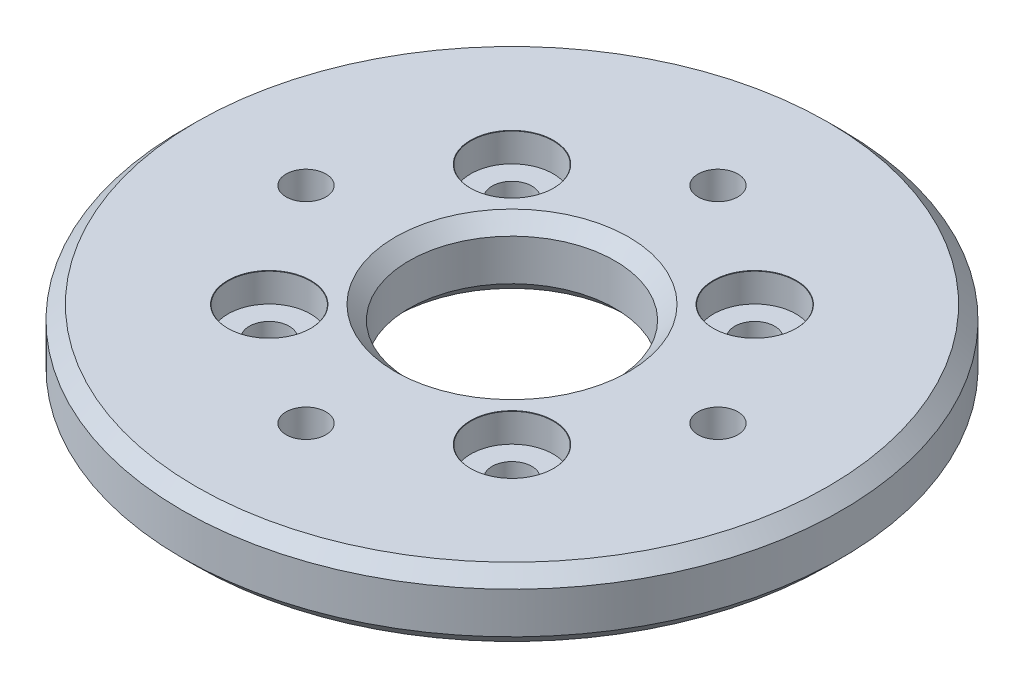
ISO-10303-21;
HEADER;
FILE_DESCRIPTION(('STEP AP214'),'2;1');
FILE_NAME('part.step','',(''),(''),'','','');
FILE_SCHEMA(('AUTOMOTIVE_DESIGN { 1 0 10303 214 1 1 1 1 }'));
ENDSEC;
DATA;
#1=APPLICATION_CONTEXT('core data for automotive mechanical design processes');
#2=APPLICATION_PROTOCOL_DEFINITION('international standard','automotive_design',2000,#1);
#3=PRODUCT_CONTEXT('',#1,'mechanical');
#4=PRODUCT('Part','Part','',(#3));
#5=PRODUCT_RELATED_PRODUCT_CATEGORY('part','',(#4));
#6=PRODUCT_DEFINITION_FORMATION('','',#4);
#7=PRODUCT_DEFINITION_CONTEXT('part definition',#1,'design');
#8=PRODUCT_DEFINITION('design','',#6,#7);
#9=PRODUCT_DEFINITION_SHAPE('','',#8);
#10=(LENGTH_UNIT() NAMED_UNIT(*) SI_UNIT(.MILLI.,.METRE.));
#11=(NAMED_UNIT(*) PLANE_ANGLE_UNIT() SI_UNIT($,.RADIAN.));
#12=(NAMED_UNIT(*) SI_UNIT($,.STERADIAN.) SOLID_ANGLE_UNIT());
#13=UNCERTAINTY_MEASURE_WITH_UNIT(LENGTH_MEASURE(1.E-05),#10,'distance_accuracy_value','');
#14=(GEOMETRIC_REPRESENTATION_CONTEXT(3) GLOBAL_UNCERTAINTY_ASSIGNED_CONTEXT((#13)) GLOBAL_UNIT_ASSIGNED_CONTEXT((#10,
#11,#12)) REPRESENTATION_CONTEXT('',''));
#15=CARTESIAN_POINT('',(0.,0.,0.));
#16=DIRECTION('',(0.,0.,1.));
#17=DIRECTION('',(1.,0.,0.));
#18=AXIS2_PLACEMENT_3D('',#15,#16,#17);
#19=CARTESIAN_POINT('',(0.,5.,0.));
#20=DIRECTION('',(0.,1.,0.));
#21=DIRECTION('',(0.,0.,1.));
#22=AXIS2_PLACEMENT_3D('',#19,#20,#21);
#23=PLANE('',#22);
#24=CARTESIAN_POINT('',(0.,5.,0.));
#25=DIRECTION('',(0.,1.,0.));
#26=DIRECTION('',(0.,0.,1.));
#27=AXIS2_PLACEMENT_3D('',#24,#25,#26);
#28=CIRCLE('',#27,23.);
#29=CARTESIAN_POINT('',(0.,5.,23.));
#30=VERTEX_POINT('',#29);
#31=EDGE_CURVE('E10',#30,#30,#28,.T.);
#32=ORIENTED_EDGE('',*,*,#31,.T.);
#33=EDGE_LOOP('',(#32));
#34=FACE_BOUND('',#33,.T.);
#35=CARTESIAN_POINT('',(0.,5.,0.));
#36=DIRECTION('',(0.,1.,0.));
#37=DIRECTION('',(0.,0.,1.));
#38=AXIS2_PLACEMENT_3D('',#35,#36,#37);
#39=CIRCLE('',#38,8.49999999999999);
#40=CARTESIAN_POINT('',(0.,5.,8.49999999999999));
#41=VERTEX_POINT('',#40);
#42=EDGE_CURVE('E70',#41,#41,#39,.F.);
#43=ORIENTED_EDGE('',*,*,#42,.T.);
#44=EDGE_LOOP('',(#43));
#45=FACE_BOUND('',#44,.T.);
#46=CARTESIAN_POINT('',(8.83883476483184,5.,8.83883476483184));
#47=DIRECTION('',(0.,1.,0.));
#48=DIRECTION('',(0.,0.,1.));
#49=AXIS2_PLACEMENT_3D('',#46,#47,#48);
#50=CIRCLE('',#49,3.025);
#51=CARTESIAN_POINT('',(8.83883476483184,5.,11.8638347648318));
#52=VERTEX_POINT('',#51);
#53=EDGE_CURVE('E102',#52,#52,#50,.T.);
#54=ORIENTED_EDGE('',*,*,#53,.F.);
#55=EDGE_LOOP('',(#54));
#56=FACE_BOUND('',#55,.T.);
#57=CARTESIAN_POINT('',(-8.83883476483184,5.,-8.83883476483184));
#58=DIRECTION('',(0.,1.,0.));
#59=DIRECTION('',(0.,0.,1.));
#60=AXIS2_PLACEMENT_3D('',#57,#58,#59);
#61=CIRCLE('',#60,3.025);
#62=CARTESIAN_POINT('',(-8.83883476483184,5.,-5.81383476483184));
#63=VERTEX_POINT('',#62);
#64=EDGE_CURVE('E122',#63,#63,#61,.T.);
#65=ORIENTED_EDGE('',*,*,#64,.F.);
#66=EDGE_LOOP('',(#65));
#67=FACE_BOUND('',#66,.T.);
#68=CARTESIAN_POINT('',(-8.83883476483184,5.,8.83883476483184));
#69=DIRECTION('',(0.,1.,0.));
#70=DIRECTION('',(0.,0.,1.));
#71=AXIS2_PLACEMENT_3D('',#68,#69,#70);
#72=CIRCLE('',#71,3.025);
#73=CARTESIAN_POINT('',(-8.83883476483184,5.,11.8638347648318));
#74=VERTEX_POINT('',#73);
#75=EDGE_CURVE('E142',#74,#74,#72,.T.);
#76=ORIENTED_EDGE('',*,*,#75,.F.);
#77=EDGE_LOOP('',(#76));
#78=FACE_BOUND('',#77,.T.);
#79=CARTESIAN_POINT('',(8.83883476483184,5.,-8.83883476483184));
#80=DIRECTION('',(0.,1.,0.));
#81=DIRECTION('',(0.,0.,1.));
#82=AXIS2_PLACEMENT_3D('',#79,#80,#81);
#83=CIRCLE('',#82,3.025);
#84=CARTESIAN_POINT('',(8.83883476483184,5.,-5.81383476483184));
#85=VERTEX_POINT('',#84);
#86=EDGE_CURVE('E162',#85,#85,#83,.T.);
#87=ORIENTED_EDGE('',*,*,#86,.F.);
#88=EDGE_LOOP('',(#87));
#89=FACE_BOUND('',#88,.T.);
#90=CARTESIAN_POINT('',(0.,5.,-15.));
#91=DIRECTION('',(0.,-1.,0.));
#92=DIRECTION('',(0.,0.,-1.));
#93=AXIS2_PLACEMENT_3D('',#90,#91,#92);
#94=CIRCLE('',#93,1.45);
#95=CARTESIAN_POINT('',(0.,5.,-16.45));
#96=VERTEX_POINT('',#95);
#97=EDGE_CURVE('E166',#96,#96,#94,.T.);
#98=ORIENTED_EDGE('',*,*,#97,.T.);
#99=EDGE_LOOP('',(#98));
#100=FACE_BOUND('',#99,.T.);
#101=CARTESIAN_POINT('',(0.,5.,15.));
#102=DIRECTION('',(0.,-1.,0.));
#103=DIRECTION('',(0.,0.,-1.));
#104=AXIS2_PLACEMENT_3D('',#101,#102,#103);
#105=CIRCLE('',#104,1.45);
#106=CARTESIAN_POINT('',(0.,5.,13.55));
#107=VERTEX_POINT('',#106);
#108=EDGE_CURVE('E186',#107,#107,#105,.T.);
#109=ORIENTED_EDGE('',*,*,#108,.T.);
#110=EDGE_LOOP('',(#109));
#111=FACE_BOUND('',#110,.T.);
#112=CARTESIAN_POINT('',(-15.,5.,0.));
#113=DIRECTION('',(0.,-1.,0.));
#114=DIRECTION('',(0.,0.,-1.));
#115=AXIS2_PLACEMENT_3D('',#112,#113,#114);
#116=CIRCLE('',#115,1.45);
#117=CARTESIAN_POINT('',(-15.,5.,-1.45));
#118=VERTEX_POINT('',#117);
#119=EDGE_CURVE('E206',#118,#118,#116,.T.);
#120=ORIENTED_EDGE('',*,*,#119,.T.);
#121=EDGE_LOOP('',(#120));
#122=FACE_BOUND('',#121,.T.);
#123=CARTESIAN_POINT('',(15.,5.,0.));
#124=DIRECTION('',(0.,-1.,0.));
#125=DIRECTION('',(0.,0.,-1.));
#126=AXIS2_PLACEMENT_3D('',#123,#124,#125);
#127=CIRCLE('',#126,1.45);
#128=CARTESIAN_POINT('',(15.,5.,-1.45));
#129=VERTEX_POINT('',#128);
#130=EDGE_CURVE('E226',#129,#129,#127,.T.);
#131=ORIENTED_EDGE('',*,*,#130,.T.);
#132=EDGE_LOOP('',(#131));
#133=FACE_BOUND('',#132,.T.);
#134=ADVANCED_FACE('F45',(#34,#45,#56,#67,#78,#89,#100,#111,#122,#133),#23,.T.);
#135=CARTESIAN_POINT('',(0.,5.,0.));
#136=DIRECTION('',(0.,-1.,0.));
#137=DIRECTION('',(0.,0.,-1.));
#138=AXIS2_PLACEMENT_3D('',#135,#136,#137);
#139=CYLINDRICAL_SURFACE('',#138,24.);
#140=CARTESIAN_POINT('',(0.,0.999999999999997,0.));
#141=DIRECTION('',(0.,1.,0.));
#142=DIRECTION('',(0.,0.,1.));
#143=AXIS2_PLACEMENT_3D('',#140,#141,#142);
#144=CIRCLE('',#143,24.);
#145=CARTESIAN_POINT('',(0.,0.999999999999997,24.));
#146=VERTEX_POINT('',#145);
#147=EDGE_CURVE('E59',#146,#146,#144,.T.);
#148=ORIENTED_EDGE('',*,*,#147,.T.);
#149=EDGE_LOOP('',(#148));
#150=FACE_BOUND('',#149,.T.);
#151=CARTESIAN_POINT('',(0.,4.00000000000001,0.));
#152=DIRECTION('',(0.,1.,0.));
#153=DIRECTION('',(0.,0.,1.));
#154=AXIS2_PLACEMENT_3D('',#151,#152,#153);
#155=CIRCLE('',#154,24.);
#156=CARTESIAN_POINT('',(0.,4.00000000000001,24.));
#157=VERTEX_POINT('',#156);
#158=EDGE_CURVE('E64',#157,#157,#155,.F.);
#159=ORIENTED_EDGE('',*,*,#158,.T.);
#160=EDGE_LOOP('',(#159));
#161=FACE_BOUND('',#160,.T.);
#162=ADVANCED_FACE('F253',(#150,#161),#139,.T.);
#163=CARTESIAN_POINT('',(0.,0.,0.));
#164=DIRECTION('',(0.,1.,0.));
#165=DIRECTION('',(0.,0.,1.));
#166=AXIS2_PLACEMENT_3D('',#163,#164,#165);
#167=PLANE('',#166);
#168=CARTESIAN_POINT('',(0.,0.,0.));
#169=DIRECTION('',(0.,1.,0.));
#170=DIRECTION('',(0.,0.,1.));
#171=AXIS2_PLACEMENT_3D('',#168,#169,#170);
#172=CIRCLE('',#171,23.);
#173=CARTESIAN_POINT('',(0.,0.,23.));
#174=VERTEX_POINT('',#173);
#175=EDGE_CURVE('E54',#174,#174,#172,.F.);
#176=ORIENTED_EDGE('',*,*,#175,.T.);
#177=EDGE_LOOP('',(#176));
#178=FACE_BOUND('',#177,.T.);
#179=CARTESIAN_POINT('',(0.,0.,0.));
#180=DIRECTION('',(0.,1.,0.));
#181=DIRECTION('',(0.,0.,1.));
#182=AXIS2_PLACEMENT_3D('',#179,#180,#181);
#183=CIRCLE('',#182,8.49999999999999);
#184=CARTESIAN_POINT('',(0.,0.,8.49999999999999));
#185=VERTEX_POINT('',#184);
#186=EDGE_CURVE('E82',#185,#185,#183,.T.);
#187=ORIENTED_EDGE('',*,*,#186,.T.);
#188=EDGE_LOOP('',(#187));
#189=FACE_BOUND('',#188,.T.);
#190=CARTESIAN_POINT('',(15.,0.,0.));
#191=DIRECTION('',(0.,-1.,0.));
#192=DIRECTION('',(0.,0.,-1.));
#193=AXIS2_PLACEMENT_3D('',#190,#191,#192);
#194=CIRCLE('',#193,3.025);
#195=CARTESIAN_POINT('',(15.,0.,-3.025));
#196=VERTEX_POINT('',#195);
#197=EDGE_CURVE('E242',#196,#196,#194,.T.);
#198=ORIENTED_EDGE('',*,*,#197,.F.);
#199=EDGE_LOOP('',(#198));
#200=FACE_BOUND('',#199,.T.);
#201=CARTESIAN_POINT('',(-15.,0.,0.));
#202=DIRECTION('',(0.,-1.,0.));
#203=DIRECTION('',(0.,0.,-1.));
#204=AXIS2_PLACEMENT_3D('',#201,#202,#203);
#205=CIRCLE('',#204,3.025);
#206=CARTESIAN_POINT('',(-15.,0.,-3.025));
#207=VERTEX_POINT('',#206);
#208=EDGE_CURVE('E222',#207,#207,#205,.T.);
#209=ORIENTED_EDGE('',*,*,#208,.F.);
#210=EDGE_LOOP('',(#209));
#211=FACE_BOUND('',#210,.T.);
#212=CARTESIAN_POINT('',(0.,0.,15.));
#213=DIRECTION('',(0.,-1.,0.));
#214=DIRECTION('',(0.,0.,-1.));
#215=AXIS2_PLACEMENT_3D('',#212,#213,#214);
#216=CIRCLE('',#215,3.025);
#217=CARTESIAN_POINT('',(0.,0.,11.975));
#218=VERTEX_POINT('',#217);
#219=EDGE_CURVE('E202',#218,#218,#216,.T.);
#220=ORIENTED_EDGE('',*,*,#219,.F.);
#221=EDGE_LOOP('',(#220));
#222=FACE_BOUND('',#221,.T.);
#223=CARTESIAN_POINT('',(0.,0.,-15.));
#224=DIRECTION('',(0.,-1.,0.));
#225=DIRECTION('',(0.,0.,-1.));
#226=AXIS2_PLACEMENT_3D('',#223,#224,#225);
#227=CIRCLE('',#226,3.025);
#228=CARTESIAN_POINT('',(0.,0.,-18.025));
#229=VERTEX_POINT('',#228);
#230=EDGE_CURVE('E182',#229,#229,#227,.T.);
#231=ORIENTED_EDGE('',*,*,#230,.F.);
#232=EDGE_LOOP('',(#231));
#233=FACE_BOUND('',#232,.T.);
#234=CARTESIAN_POINT('',(8.83883476483184,0.,-8.83883476483184));
#235=DIRECTION('',(0.,1.,0.));
#236=DIRECTION('',(0.,0.,1.));
#237=AXIS2_PLACEMENT_3D('',#234,#235,#236);
#238=CIRCLE('',#237,1.45);
#239=CARTESIAN_POINT('',(8.83883476483184,0.,-7.38883476483185));
#240=VERTEX_POINT('',#239);
#241=EDGE_CURVE('E146',#240,#240,#238,.T.);
#242=ORIENTED_EDGE('',*,*,#241,.T.);
#243=EDGE_LOOP('',(#242));
#244=FACE_BOUND('',#243,.T.);
#245=CARTESIAN_POINT('',(-8.83883476483184,0.,8.83883476483184));
#246=DIRECTION('',(0.,1.,0.));
#247=DIRECTION('',(0.,0.,1.));
#248=AXIS2_PLACEMENT_3D('',#245,#246,#247);
#249=CIRCLE('',#248,1.45);
#250=CARTESIAN_POINT('',(-8.83883476483184,0.,10.2888347648318));
#251=VERTEX_POINT('',#250);
#252=EDGE_CURVE('E126',#251,#251,#249,.T.);
#253=ORIENTED_EDGE('',*,*,#252,.T.);
#254=EDGE_LOOP('',(#253));
#255=FACE_BOUND('',#254,.T.);
#256=CARTESIAN_POINT('',(-8.83883476483184,0.,-8.83883476483184));
#257=DIRECTION('',(0.,1.,0.));
#258=DIRECTION('',(0.,0.,1.));
#259=AXIS2_PLACEMENT_3D('',#256,#257,#258);
#260=CIRCLE('',#259,1.45);
#261=CARTESIAN_POINT('',(-8.83883476483184,0.,-7.38883476483185));
#262=VERTEX_POINT('',#261);
#263=EDGE_CURVE('E106',#262,#262,#260,.T.);
#264=ORIENTED_EDGE('',*,*,#263,.T.);
#265=EDGE_LOOP('',(#264));
#266=FACE_BOUND('',#265,.T.);
#267=CARTESIAN_POINT('',(8.83883476483184,0.,8.83883476483184));
#268=DIRECTION('',(0.,1.,0.));
#269=DIRECTION('',(0.,0.,1.));
#270=AXIS2_PLACEMENT_3D('',#267,#268,#269);
#271=CIRCLE('',#270,1.45);
#272=CARTESIAN_POINT('',(8.83883476483184,0.,10.2888347648318));
#273=VERTEX_POINT('',#272);
#274=EDGE_CURVE('E86',#273,#273,#271,.T.);
#275=ORIENTED_EDGE('',*,*,#274,.T.);
#276=EDGE_LOOP('',(#275));
#277=FACE_BOUND('',#276,.T.);
#278=ADVANCED_FACE('F249',(#178,#189,#200,#211,#222,#233,#244,#255,#266,#277),#167,.F.);
#279=CARTESIAN_POINT('',(8.83883476483184,5.,8.83883476483184));
#280=DIRECTION('',(0.,1.,0.));
#281=DIRECTION('',(0.,0.,1.));
#282=AXIS2_PLACEMENT_3D('',#279,#280,#281);
#283=CYLINDRICAL_SURFACE('',#282,1.45);
#284=ORIENTED_EDGE('',*,*,#274,.F.);
#285=EDGE_LOOP('',(#284));
#286=FACE_BOUND('',#285,.T.);
#287=CARTESIAN_POINT('',(8.83883476483184,2.9,8.83883476483184));
#288=DIRECTION('',(0.,1.,0.));
#289=DIRECTION('',(0.,0.,1.));
#290=AXIS2_PLACEMENT_3D('',#287,#288,#289);
#291=CIRCLE('',#290,1.45);
#292=CARTESIAN_POINT('',(8.83883476483184,2.9,10.2888347648318));
#293=VERTEX_POINT('',#292);
#294=EDGE_CURVE('E90',#293,#293,#291,.T.);
#295=ORIENTED_EDGE('',*,*,#294,.T.);
#296=EDGE_LOOP('',(#295));
#297=FACE_BOUND('',#296,.T.);
#298=ADVANCED_FACE('F252',(#286,#297),#283,.F.);
#299=CARTESIAN_POINT('',(11.8388347648318,2.9,8.83883476483184));
#300=DIRECTION('',(0.,-1.,0.));
#301=DIRECTION('',(0.,0.,-1.));
#302=AXIS2_PLACEMENT_3D('',#299,#300,#301);
#303=PLANE('',#302);
#304=ORIENTED_EDGE('',*,*,#294,.F.);
#305=EDGE_LOOP('',(#304));
#306=FACE_BOUND('',#305,.T.);
#307=CARTESIAN_POINT('',(8.83883476483184,2.9,8.83883476483184));
#308=DIRECTION('',(0.,1.,0.));
#309=DIRECTION('',(0.,0.,1.));
#310=AXIS2_PLACEMENT_3D('',#307,#308,#309);
#311=CIRCLE('',#310,3.);
#312=CARTESIAN_POINT('',(8.83883476483184,2.9,11.8388347648318));
#313=VERTEX_POINT('',#312);
#314=EDGE_CURVE('E94',#313,#313,#311,.T.);
#315=ORIENTED_EDGE('',*,*,#314,.T.);
#316=EDGE_LOOP('',(#315));
#317=FACE_BOUND('',#316,.T.);
#318=ADVANCED_FACE('F271',(#306,#317),#303,.F.);
#319=CARTESIAN_POINT('',(8.83883476483184,5.,8.83883476483184));
#320=DIRECTION('',(0.,1.,0.));
#321=DIRECTION('',(0.,0.,1.));
#322=AXIS2_PLACEMENT_3D('',#319,#320,#321);
#323=CYLINDRICAL_SURFACE('',#322,3.);
#324=ORIENTED_EDGE('',*,*,#314,.F.);
#325=EDGE_LOOP('',(#324));
#326=FACE_BOUND('',#325,.T.);
#327=CARTESIAN_POINT('',(8.83883476483184,4.975,8.83883476483184));
#328=DIRECTION('',(0.,1.,0.));
#329=DIRECTION('',(0.,0.,1.));
#330=AXIS2_PLACEMENT_3D('',#327,#328,#329);
#331=CIRCLE('',#330,3.);
#332=CARTESIAN_POINT('',(8.83883476483184,4.975,11.8388347648318));
#333=VERTEX_POINT('',#332);
#334=EDGE_CURVE('E98',#333,#333,#331,.T.);
#335=ORIENTED_EDGE('',*,*,#334,.T.);
#336=EDGE_LOOP('',(#335));
#337=FACE_BOUND('',#336,.T.);
#338=ADVANCED_FACE('F277',(#326,#337),#323,.F.);
#339=CARTESIAN_POINT('',(8.83883476483184,5.,8.83883476483184));
#340=DIRECTION('',(0.,1.,0.));
#341=DIRECTION('',(0.,0.,1.));
#342=AXIS2_PLACEMENT_3D('',#339,#340,#341);
#343=CONICAL_SURFACE('',#342,3.025,0.785398163397466);
#344=ORIENTED_EDGE('',*,*,#334,.F.);
#345=EDGE_LOOP('',(#344));
#346=FACE_BOUND('',#345,.T.);
#347=ORIENTED_EDGE('',*,*,#53,.T.);
#348=EDGE_LOOP('',(#347));
#349=FACE_BOUND('',#348,.T.);
#350=ADVANCED_FACE('F283',(#346,#349),#343,.F.);
#351=CARTESIAN_POINT('',(-8.83883476483184,5.,-8.83883476483184));
#352=DIRECTION('',(0.,1.,0.));
#353=DIRECTION('',(0.,0.,1.));
#354=AXIS2_PLACEMENT_3D('',#351,#352,#353);
#355=CYLINDRICAL_SURFACE('',#354,1.45);
#356=ORIENTED_EDGE('',*,*,#263,.F.);
#357=EDGE_LOOP('',(#356));
#358=FACE_BOUND('',#357,.T.);
#359=CARTESIAN_POINT('',(-8.83883476483184,2.9,-8.83883476483184));
#360=DIRECTION('',(0.,1.,0.));
#361=DIRECTION('',(0.,0.,1.));
#362=AXIS2_PLACEMENT_3D('',#359,#360,#361);
#363=CIRCLE('',#362,1.45);
#364=CARTESIAN_POINT('',(-8.83883476483184,2.9,-7.38883476483184));
#365=VERTEX_POINT('',#364);
#366=EDGE_CURVE('E110',#365,#365,#363,.T.);
#367=ORIENTED_EDGE('',*,*,#366,.T.);
#368=EDGE_LOOP('',(#367));
#369=FACE_BOUND('',#368,.T.);
#370=ADVANCED_FACE('F289',(#358,#369),#355,.F.);
#371=CARTESIAN_POINT('',(-5.83883476483184,2.9,-8.83883476483184));
#372=DIRECTION('',(0.,-1.,0.));
#373=DIRECTION('',(0.,0.,-1.));
#374=AXIS2_PLACEMENT_3D('',#371,#372,#373);
#375=PLANE('',#374);
#376=ORIENTED_EDGE('',*,*,#366,.F.);
#377=EDGE_LOOP('',(#376));
#378=FACE_BOUND('',#377,.T.);
#379=CARTESIAN_POINT('',(-8.83883476483184,2.9,-8.83883476483184));
#380=DIRECTION('',(0.,1.,0.));
#381=DIRECTION('',(0.,0.,1.));
#382=AXIS2_PLACEMENT_3D('',#379,#380,#381);
#383=CIRCLE('',#382,3.);
#384=CARTESIAN_POINT('',(-8.83883476483184,2.9,-5.83883476483184));
#385=VERTEX_POINT('',#384);
#386=EDGE_CURVE('E114',#385,#385,#383,.T.);
#387=ORIENTED_EDGE('',*,*,#386,.T.);
#388=EDGE_LOOP('',(#387));
#389=FACE_BOUND('',#388,.T.);
#390=ADVANCED_FACE('F425',(#378,#389),#375,.F.);
#391=CARTESIAN_POINT('',(-8.83883476483184,5.,-8.83883476483184));
#392=DIRECTION('',(0.,1.,0.));
#393=DIRECTION('',(0.,0.,1.));
#394=AXIS2_PLACEMENT_3D('',#391,#392,#393);
#395=CYLINDRICAL_SURFACE('',#394,3.);
#396=ORIENTED_EDGE('',*,*,#386,.F.);
#397=EDGE_LOOP('',(#396));
#398=FACE_BOUND('',#397,.T.);
#399=CARTESIAN_POINT('',(-8.83883476483184,4.975,-8.83883476483184));
#400=DIRECTION('',(0.,1.,0.));
#401=DIRECTION('',(0.,0.,1.));
#402=AXIS2_PLACEMENT_3D('',#399,#400,#401);
#403=CIRCLE('',#402,3.);
#404=CARTESIAN_POINT('',(-8.83883476483184,4.975,-5.83883476483184));
#405=VERTEX_POINT('',#404);
#406=EDGE_CURVE('E118',#405,#405,#403,.T.);
#407=ORIENTED_EDGE('',*,*,#406,.T.);
#408=EDGE_LOOP('',(#407));
#409=FACE_BOUND('',#408,.T.);
#410=ADVANCED_FACE('F421',(#398,#409),#395,.F.);
#411=CARTESIAN_POINT('',(-8.83883476483184,5.,-8.83883476483184));
#412=DIRECTION('',(0.,1.,0.));
#413=DIRECTION('',(0.,0.,1.));
#414=AXIS2_PLACEMENT_3D('',#411,#412,#413);
#415=CONICAL_SURFACE('',#414,3.025,0.785398163397466);
#416=ORIENTED_EDGE('',*,*,#406,.F.);
#417=EDGE_LOOP('',(#416));
#418=FACE_BOUND('',#417,.T.);
#419=ORIENTED_EDGE('',*,*,#64,.T.);
#420=EDGE_LOOP('',(#419));
#421=FACE_BOUND('',#420,.T.);
#422=ADVANCED_FACE('F417',(#418,#421),#415,.F.);
#423=CARTESIAN_POINT('',(-8.83883476483184,5.,8.83883476483184));
#424=DIRECTION('',(0.,1.,0.));
#425=DIRECTION('',(0.,0.,1.));
#426=AXIS2_PLACEMENT_3D('',#423,#424,#425);
#427=CYLINDRICAL_SURFACE('',#426,1.45);
#428=ORIENTED_EDGE('',*,*,#252,.F.);
#429=EDGE_LOOP('',(#428));
#430=FACE_BOUND('',#429,.T.);
#431=CARTESIAN_POINT('',(-8.83883476483184,2.9,8.83883476483184));
#432=DIRECTION('',(0.,1.,0.));
#433=DIRECTION('',(0.,0.,1.));
#434=AXIS2_PLACEMENT_3D('',#431,#432,#433);
#435=CIRCLE('',#434,1.45);
#436=CARTESIAN_POINT('',(-8.83883476483184,2.9,10.2888347648318));
#437=VERTEX_POINT('',#436);
#438=EDGE_CURVE('E130',#437,#437,#435,.T.);
#439=ORIENTED_EDGE('',*,*,#438,.T.);
#440=EDGE_LOOP('',(#439));
#441=FACE_BOUND('',#440,.T.);
#442=ADVANCED_FACE('F413',(#430,#441),#427,.F.);
#443=CARTESIAN_POINT('',(-5.83883476483184,2.9,8.83883476483184));
#444=DIRECTION('',(0.,-1.,0.));
#445=DIRECTION('',(0.,0.,-1.));
#446=AXIS2_PLACEMENT_3D('',#443,#444,#445);
#447=PLANE('',#446);
#448=ORIENTED_EDGE('',*,*,#438,.F.);
#449=EDGE_LOOP('',(#448));
#450=FACE_BOUND('',#449,.T.);
#451=CARTESIAN_POINT('',(-8.83883476483184,2.9,8.83883476483184));
#452=DIRECTION('',(0.,1.,0.));
#453=DIRECTION('',(0.,0.,1.));
#454=AXIS2_PLACEMENT_3D('',#451,#452,#453);
#455=CIRCLE('',#454,3.);
#456=CARTESIAN_POINT('',(-8.83883476483184,2.9,11.8388347648318));
#457=VERTEX_POINT('',#456);
#458=EDGE_CURVE('E134',#457,#457,#455,.T.);
#459=ORIENTED_EDGE('',*,*,#458,.T.);
#460=EDGE_LOOP('',(#459));
#461=FACE_BOUND('',#460,.T.);
#462=ADVANCED_FACE('F409',(#450,#461),#447,.F.);
#463=CARTESIAN_POINT('',(-8.83883476483184,5.,8.83883476483184));
#464=DIRECTION('',(0.,1.,0.));
#465=DIRECTION('',(0.,0.,1.));
#466=AXIS2_PLACEMENT_3D('',#463,#464,#465);
#467=CYLINDRICAL_SURFACE('',#466,3.);
#468=ORIENTED_EDGE('',*,*,#458,.F.);
#469=EDGE_LOOP('',(#468));
#470=FACE_BOUND('',#469,.T.);
#471=CARTESIAN_POINT('',(-8.83883476483184,4.975,8.83883476483184));
#472=DIRECTION('',(0.,1.,0.));
#473=DIRECTION('',(0.,0.,1.));
#474=AXIS2_PLACEMENT_3D('',#471,#472,#473);
#475=CIRCLE('',#474,3.);
#476=CARTESIAN_POINT('',(-8.83883476483184,4.975,11.8388347648318));
#477=VERTEX_POINT('',#476);
#478=EDGE_CURVE('E138',#477,#477,#475,.T.);
#479=ORIENTED_EDGE('',*,*,#478,.T.);
#480=EDGE_LOOP('',(#479));
#481=FACE_BOUND('',#480,.T.);
#482=ADVANCED_FACE('F405',(#470,#481),#467,.F.);
#483=CARTESIAN_POINT('',(-8.83883476483184,5.,8.83883476483184));
#484=DIRECTION('',(0.,1.,0.));
#485=DIRECTION('',(0.,0.,1.));
#486=AXIS2_PLACEMENT_3D('',#483,#484,#485);
#487=CONICAL_SURFACE('',#486,3.025,0.785398163397466);
#488=ORIENTED_EDGE('',*,*,#478,.F.);
#489=EDGE_LOOP('',(#488));
#490=FACE_BOUND('',#489,.T.);
#491=ORIENTED_EDGE('',*,*,#75,.T.);
#492=EDGE_LOOP('',(#491));
#493=FACE_BOUND('',#492,.T.);
#494=ADVANCED_FACE('F401',(#490,#493),#487,.F.);
#495=CARTESIAN_POINT('',(8.83883476483184,5.,-8.83883476483184));
#496=DIRECTION('',(0.,1.,0.));
#497=DIRECTION('',(0.,0.,1.));
#498=AXIS2_PLACEMENT_3D('',#495,#496,#497);
#499=CYLINDRICAL_SURFACE('',#498,1.45);
#500=ORIENTED_EDGE('',*,*,#241,.F.);
#501=EDGE_LOOP('',(#500));
#502=FACE_BOUND('',#501,.T.);
#503=CARTESIAN_POINT('',(8.83883476483184,2.9,-8.83883476483184));
#504=DIRECTION('',(0.,1.,0.));
#505=DIRECTION('',(0.,0.,1.));
#506=AXIS2_PLACEMENT_3D('',#503,#504,#505);
#507=CIRCLE('',#506,1.45);
#508=CARTESIAN_POINT('',(8.83883476483184,2.9,-7.38883476483184));
#509=VERTEX_POINT('',#508);
#510=EDGE_CURVE('E150',#509,#509,#507,.T.);
#511=ORIENTED_EDGE('',*,*,#510,.T.);
#512=EDGE_LOOP('',(#511));
#513=FACE_BOUND('',#512,.T.);
#514=ADVANCED_FACE('F397',(#502,#513),#499,.F.);
#515=CARTESIAN_POINT('',(11.8388347648318,2.9,-8.83883476483184));
#516=DIRECTION('',(0.,-1.,0.));
#517=DIRECTION('',(0.,0.,-1.));
#518=AXIS2_PLACEMENT_3D('',#515,#516,#517);
#519=PLANE('',#518);
#520=ORIENTED_EDGE('',*,*,#510,.F.);
#521=EDGE_LOOP('',(#520));
#522=FACE_BOUND('',#521,.T.);
#523=CARTESIAN_POINT('',(8.83883476483184,2.9,-8.83883476483184));
#524=DIRECTION('',(0.,1.,0.));
#525=DIRECTION('',(0.,0.,1.));
#526=AXIS2_PLACEMENT_3D('',#523,#524,#525);
#527=CIRCLE('',#526,3.);
#528=CARTESIAN_POINT('',(8.83883476483184,2.9,-5.83883476483184));
#529=VERTEX_POINT('',#528);
#530=EDGE_CURVE('E154',#529,#529,#527,.T.);
#531=ORIENTED_EDGE('',*,*,#530,.T.);
#532=EDGE_LOOP('',(#531));
#533=FACE_BOUND('',#532,.T.);
#534=ADVANCED_FACE('F393',(#522,#533),#519,.F.);
#535=CARTESIAN_POINT('',(8.83883476483184,5.,-8.83883476483184));
#536=DIRECTION('',(0.,1.,0.));
#537=DIRECTION('',(0.,0.,1.));
#538=AXIS2_PLACEMENT_3D('',#535,#536,#537);
#539=CYLINDRICAL_SURFACE('',#538,3.);
#540=ORIENTED_EDGE('',*,*,#530,.F.);
#541=EDGE_LOOP('',(#540));
#542=FACE_BOUND('',#541,.T.);
#543=CARTESIAN_POINT('',(8.83883476483184,4.975,-8.83883476483184));
#544=DIRECTION('',(0.,1.,0.));
#545=DIRECTION('',(0.,0.,1.));
#546=AXIS2_PLACEMENT_3D('',#543,#544,#545);
#547=CIRCLE('',#546,3.);
#548=CARTESIAN_POINT('',(8.83883476483184,4.975,-5.83883476483184));
#549=VERTEX_POINT('',#548);
#550=EDGE_CURVE('E158',#549,#549,#547,.T.);
#551=ORIENTED_EDGE('',*,*,#550,.T.);
#552=EDGE_LOOP('',(#551));
#553=FACE_BOUND('',#552,.T.);
#554=ADVANCED_FACE('F389',(#542,#553),#539,.F.);
#555=CARTESIAN_POINT('',(8.83883476483184,5.,-8.83883476483184));
#556=DIRECTION('',(0.,1.,0.));
#557=DIRECTION('',(0.,0.,1.));
#558=AXIS2_PLACEMENT_3D('',#555,#556,#557);
#559=CONICAL_SURFACE('',#558,3.025,0.785398163397466);
#560=ORIENTED_EDGE('',*,*,#550,.F.);
#561=EDGE_LOOP('',(#560));
#562=FACE_BOUND('',#561,.T.);
#563=ORIENTED_EDGE('',*,*,#86,.T.);
#564=EDGE_LOOP('',(#563));
#565=FACE_BOUND('',#564,.T.);
#566=ADVANCED_FACE('F385',(#562,#565),#559,.F.);
#567=CARTESIAN_POINT('',(0.,0.,-15.));
#568=DIRECTION('',(0.,-1.,0.));
#569=DIRECTION('',(0.,0.,-1.));
#570=AXIS2_PLACEMENT_3D('',#567,#568,#569);
#571=CYLINDRICAL_SURFACE('',#570,1.45000000000001);
#572=ORIENTED_EDGE('',*,*,#97,.F.);
#573=EDGE_LOOP('',(#572));
#574=FACE_BOUND('',#573,.T.);
#575=CARTESIAN_POINT('',(0.,2.09999999999999,-15.));
#576=DIRECTION('',(0.,-1.,0.));
#577=DIRECTION('',(0.,0.,-1.));
#578=AXIS2_PLACEMENT_3D('',#575,#576,#577);
#579=CIRCLE('',#578,1.45000000000001);
#580=CARTESIAN_POINT('',(0.,2.09999999999999,-16.45));
#581=VERTEX_POINT('',#580);
#582=EDGE_CURVE('E170',#581,#581,#579,.T.);
#583=ORIENTED_EDGE('',*,*,#582,.T.);
#584=EDGE_LOOP('',(#583));
#585=FACE_BOUND('',#584,.T.);
#586=ADVANCED_FACE('F381',(#574,#585),#571,.F.);
#587=CARTESIAN_POINT('',(3.,2.09999999999999,-15.));
#588=DIRECTION('',(0.,1.,0.));
#589=DIRECTION('',(0.,0.,1.));
#590=AXIS2_PLACEMENT_3D('',#587,#588,#589);
#591=PLANE('',#590);
#592=ORIENTED_EDGE('',*,*,#582,.F.);
#593=EDGE_LOOP('',(#592));
#594=FACE_BOUND('',#593,.T.);
#595=CARTESIAN_POINT('',(0.,2.09999999999999,-15.));
#596=DIRECTION('',(0.,-1.,0.));
#597=DIRECTION('',(0.,0.,-1.));
#598=AXIS2_PLACEMENT_3D('',#595,#596,#597);
#599=CIRCLE('',#598,3.);
#600=CARTESIAN_POINT('',(0.,2.09999999999999,-18.));
#601=VERTEX_POINT('',#600);
#602=EDGE_CURVE('E174',#601,#601,#599,.T.);
#603=ORIENTED_EDGE('',*,*,#602,.T.);
#604=EDGE_LOOP('',(#603));
#605=FACE_BOUND('',#604,.T.);
#606=ADVANCED_FACE('F377',(#594,#605),#591,.F.);
#607=CARTESIAN_POINT('',(0.,0.,-15.));
#608=DIRECTION('',(0.,-1.,0.));
#609=DIRECTION('',(0.,0.,-1.));
#610=AXIS2_PLACEMENT_3D('',#607,#608,#609);
#611=CYLINDRICAL_SURFACE('',#610,3.);
#612=ORIENTED_EDGE('',*,*,#602,.F.);
#613=EDGE_LOOP('',(#612));
#614=FACE_BOUND('',#613,.T.);
#615=CARTESIAN_POINT('',(0.,0.0249999999999916,-15.));
#616=DIRECTION('',(0.,-1.,0.));
#617=DIRECTION('',(0.,0.,-1.));
#618=AXIS2_PLACEMENT_3D('',#615,#616,#617);
#619=CIRCLE('',#618,3.);
#620=CARTESIAN_POINT('',(0.,0.0249999999999916,-18.));
#621=VERTEX_POINT('',#620);
#622=EDGE_CURVE('E178',#621,#621,#619,.T.);
#623=ORIENTED_EDGE('',*,*,#622,.T.);
#624=EDGE_LOOP('',(#623));
#625=FACE_BOUND('',#624,.T.);
#626=ADVANCED_FACE('F373',(#614,#625),#611,.F.);
#627=CARTESIAN_POINT('',(0.,0.,-15.));
#628=DIRECTION('',(0.,-1.,0.));
#629=DIRECTION('',(0.,0.,-1.));
#630=AXIS2_PLACEMENT_3D('',#627,#628,#629);
#631=CONICAL_SURFACE('',#630,3.025,0.78539816339763);
#632=ORIENTED_EDGE('',*,*,#622,.F.);
#633=EDGE_LOOP('',(#632));
#634=FACE_BOUND('',#633,.T.);
#635=ORIENTED_EDGE('',*,*,#230,.T.);
#636=EDGE_LOOP('',(#635));
#637=FACE_BOUND('',#636,.T.);
#638=ADVANCED_FACE('F369',(#634,#637),#631,.F.);
#639=CARTESIAN_POINT('',(0.,0.,15.));
#640=DIRECTION('',(0.,-1.,0.));
#641=DIRECTION('',(0.,0.,-1.));
#642=AXIS2_PLACEMENT_3D('',#639,#640,#641);
#643=CYLINDRICAL_SURFACE('',#642,1.45000000000001);
#644=ORIENTED_EDGE('',*,*,#108,.F.);
#645=EDGE_LOOP('',(#644));
#646=FACE_BOUND('',#645,.T.);
#647=CARTESIAN_POINT('',(0.,2.09999999999999,15.));
#648=DIRECTION('',(0.,-1.,0.));
#649=DIRECTION('',(0.,0.,-1.));
#650=AXIS2_PLACEMENT_3D('',#647,#648,#649);
#651=CIRCLE('',#650,1.45000000000001);
#652=CARTESIAN_POINT('',(0.,2.09999999999999,13.55));
#653=VERTEX_POINT('',#652);
#654=EDGE_CURVE('E190',#653,#653,#651,.T.);
#655=ORIENTED_EDGE('',*,*,#654,.T.);
#656=EDGE_LOOP('',(#655));
#657=FACE_BOUND('',#656,.T.);
#658=ADVANCED_FACE('F365',(#646,#657),#643,.F.);
#659=CARTESIAN_POINT('',(3.,2.09999999999999,15.));
#660=DIRECTION('',(0.,1.,0.));
#661=DIRECTION('',(0.,0.,1.));
#662=AXIS2_PLACEMENT_3D('',#659,#660,#661);
#663=PLANE('',#662);
#664=ORIENTED_EDGE('',*,*,#654,.F.);
#665=EDGE_LOOP('',(#664));
#666=FACE_BOUND('',#665,.T.);
#667=CARTESIAN_POINT('',(0.,2.09999999999999,15.));
#668=DIRECTION('',(0.,-1.,0.));
#669=DIRECTION('',(0.,0.,-1.));
#670=AXIS2_PLACEMENT_3D('',#667,#668,#669);
#671=CIRCLE('',#670,3.);
#672=CARTESIAN_POINT('',(0.,2.09999999999999,12.));
#673=VERTEX_POINT('',#672);
#674=EDGE_CURVE('E194',#673,#673,#671,.T.);
#675=ORIENTED_EDGE('',*,*,#674,.T.);
#676=EDGE_LOOP('',(#675));
#677=FACE_BOUND('',#676,.T.);
#678=ADVANCED_FACE('F361',(#666,#677),#663,.F.);
#679=CARTESIAN_POINT('',(0.,0.,15.));
#680=DIRECTION('',(0.,-1.,0.));
#681=DIRECTION('',(0.,0.,-1.));
#682=AXIS2_PLACEMENT_3D('',#679,#680,#681);
#683=CYLINDRICAL_SURFACE('',#682,3.);
#684=ORIENTED_EDGE('',*,*,#674,.F.);
#685=EDGE_LOOP('',(#684));
#686=FACE_BOUND('',#685,.T.);
#687=CARTESIAN_POINT('',(0.,0.0249999999999916,15.));
#688=DIRECTION('',(0.,-1.,0.));
#689=DIRECTION('',(0.,0.,-1.));
#690=AXIS2_PLACEMENT_3D('',#687,#688,#689);
#691=CIRCLE('',#690,3.);
#692=CARTESIAN_POINT('',(0.,0.0249999999999916,12.));
#693=VERTEX_POINT('',#692);
#694=EDGE_CURVE('E198',#693,#693,#691,.T.);
#695=ORIENTED_EDGE('',*,*,#694,.T.);
#696=EDGE_LOOP('',(#695));
#697=FACE_BOUND('',#696,.T.);
#698=ADVANCED_FACE('F357',(#686,#697),#683,.F.);
#699=CARTESIAN_POINT('',(0.,0.,15.));
#700=DIRECTION('',(0.,-1.,0.));
#701=DIRECTION('',(0.,0.,-1.));
#702=AXIS2_PLACEMENT_3D('',#699,#700,#701);
#703=CONICAL_SURFACE('',#702,3.025,0.78539816339763);
#704=ORIENTED_EDGE('',*,*,#694,.F.);
#705=EDGE_LOOP('',(#704));
#706=FACE_BOUND('',#705,.T.);
#707=ORIENTED_EDGE('',*,*,#219,.T.);
#708=EDGE_LOOP('',(#707));
#709=FACE_BOUND('',#708,.T.);
#710=ADVANCED_FACE('F353',(#706,#709),#703,.F.);
#711=CARTESIAN_POINT('',(-15.,0.,0.));
#712=DIRECTION('',(0.,-1.,0.));
#713=DIRECTION('',(0.,0.,-1.));
#714=AXIS2_PLACEMENT_3D('',#711,#712,#713);
#715=CYLINDRICAL_SURFACE('',#714,1.45000000000001);
#716=ORIENTED_EDGE('',*,*,#119,.F.);
#717=EDGE_LOOP('',(#716));
#718=FACE_BOUND('',#717,.T.);
#719=CARTESIAN_POINT('',(-15.,2.09999999999999,0.));
#720=DIRECTION('',(0.,-1.,0.));
#721=DIRECTION('',(0.,0.,-1.));
#722=AXIS2_PLACEMENT_3D('',#719,#720,#721);
#723=CIRCLE('',#722,1.45000000000001);
#724=CARTESIAN_POINT('',(-15.,2.09999999999999,-1.45000000000001));
#725=VERTEX_POINT('',#724);
#726=EDGE_CURVE('E210',#725,#725,#723,.T.);
#727=ORIENTED_EDGE('',*,*,#726,.T.);
#728=EDGE_LOOP('',(#727));
#729=FACE_BOUND('',#728,.T.);
#730=ADVANCED_FACE('F349',(#718,#729),#715,.F.);
#731=CARTESIAN_POINT('',(-12.,2.09999999999999,0.));
#732=DIRECTION('',(0.,1.,0.));
#733=DIRECTION('',(0.,0.,1.));
#734=AXIS2_PLACEMENT_3D('',#731,#732,#733);
#735=PLANE('',#734);
#736=ORIENTED_EDGE('',*,*,#726,.F.);
#737=EDGE_LOOP('',(#736));
#738=FACE_BOUND('',#737,.T.);
#739=CARTESIAN_POINT('',(-15.,2.09999999999999,0.));
#740=DIRECTION('',(0.,-1.,0.));
#741=DIRECTION('',(0.,0.,-1.));
#742=AXIS2_PLACEMENT_3D('',#739,#740,#741);
#743=CIRCLE('',#742,3.);
#744=CARTESIAN_POINT('',(-15.,2.09999999999999,-3.));
#745=VERTEX_POINT('',#744);
#746=EDGE_CURVE('E214',#745,#745,#743,.T.);
#747=ORIENTED_EDGE('',*,*,#746,.T.);
#748=EDGE_LOOP('',(#747));
#749=FACE_BOUND('',#748,.T.);
#750=ADVANCED_FACE('F345',(#738,#749),#735,.F.);
#751=CARTESIAN_POINT('',(-15.,0.,0.));
#752=DIRECTION('',(0.,-1.,0.));
#753=DIRECTION('',(0.,0.,-1.));
#754=AXIS2_PLACEMENT_3D('',#751,#752,#753);
#755=CYLINDRICAL_SURFACE('',#754,3.);
#756=ORIENTED_EDGE('',*,*,#746,.F.);
#757=EDGE_LOOP('',(#756));
#758=FACE_BOUND('',#757,.T.);
#759=CARTESIAN_POINT('',(-15.,0.0249999999999916,0.));
#760=DIRECTION('',(0.,-1.,0.));
#761=DIRECTION('',(0.,0.,-1.));
#762=AXIS2_PLACEMENT_3D('',#759,#760,#761);
#763=CIRCLE('',#762,3.);
#764=CARTESIAN_POINT('',(-15.,0.0249999999999916,-3.));
#765=VERTEX_POINT('',#764);
#766=EDGE_CURVE('E218',#765,#765,#763,.T.);
#767=ORIENTED_EDGE('',*,*,#766,.T.);
#768=EDGE_LOOP('',(#767));
#769=FACE_BOUND('',#768,.T.);
#770=ADVANCED_FACE('F341',(#758,#769),#755,.F.);
#771=CARTESIAN_POINT('',(-15.,0.,0.));
#772=DIRECTION('',(0.,-1.,0.));
#773=DIRECTION('',(0.,0.,-1.));
#774=AXIS2_PLACEMENT_3D('',#771,#772,#773);
#775=CONICAL_SURFACE('',#774,3.025,0.78539816339763);
#776=ORIENTED_EDGE('',*,*,#766,.F.);
#777=EDGE_LOOP('',(#776));
#778=FACE_BOUND('',#777,.T.);
#779=ORIENTED_EDGE('',*,*,#208,.T.);
#780=EDGE_LOOP('',(#779));
#781=FACE_BOUND('',#780,.T.);
#782=ADVANCED_FACE('F314',(#778,#781),#775,.F.);
#783=CARTESIAN_POINT('',(15.,0.,0.));
#784=DIRECTION('',(0.,-1.,0.));
#785=DIRECTION('',(0.,0.,-1.));
#786=AXIS2_PLACEMENT_3D('',#783,#784,#785);
#787=CYLINDRICAL_SURFACE('',#786,1.45000000000001);
#788=ORIENTED_EDGE('',*,*,#130,.F.);
#789=EDGE_LOOP('',(#788));
#790=FACE_BOUND('',#789,.T.);
#791=CARTESIAN_POINT('',(15.,2.09999999999999,0.));
#792=DIRECTION('',(0.,-1.,0.));
#793=DIRECTION('',(0.,0.,-1.));
#794=AXIS2_PLACEMENT_3D('',#791,#792,#793);
#795=CIRCLE('',#794,1.45000000000001);
#796=CARTESIAN_POINT('',(15.,2.09999999999999,-1.45000000000001));
#797=VERTEX_POINT('',#796);
#798=EDGE_CURVE('E230',#797,#797,#795,.T.);
#799=ORIENTED_EDGE('',*,*,#798,.T.);
#800=EDGE_LOOP('',(#799));
#801=FACE_BOUND('',#800,.T.);
#802=ADVANCED_FACE('F310',(#790,#801),#787,.F.);
#803=CARTESIAN_POINT('',(18.,2.09999999999999,0.));
#804=DIRECTION('',(0.,1.,0.));
#805=DIRECTION('',(0.,0.,1.));
#806=AXIS2_PLACEMENT_3D('',#803,#804,#805);
#807=PLANE('',#806);
#808=ORIENTED_EDGE('',*,*,#798,.F.);
#809=EDGE_LOOP('',(#808));
#810=FACE_BOUND('',#809,.T.);
#811=CARTESIAN_POINT('',(15.,2.09999999999999,0.));
#812=DIRECTION('',(0.,-1.,0.));
#813=DIRECTION('',(0.,0.,-1.));
#814=AXIS2_PLACEMENT_3D('',#811,#812,#813);
#815=CIRCLE('',#814,3.);
#816=CARTESIAN_POINT('',(15.,2.09999999999999,-3.));
#817=VERTEX_POINT('',#816);
#818=EDGE_CURVE('E234',#817,#817,#815,.T.);
#819=ORIENTED_EDGE('',*,*,#818,.T.);
#820=EDGE_LOOP('',(#819));
#821=FACE_BOUND('',#820,.T.);
#822=ADVANCED_FACE('F313',(#810,#821),#807,.F.);
#823=CARTESIAN_POINT('',(15.,0.,0.));
#824=DIRECTION('',(0.,-1.,0.));
#825=DIRECTION('',(0.,0.,-1.));
#826=AXIS2_PLACEMENT_3D('',#823,#824,#825);
#827=CYLINDRICAL_SURFACE('',#826,3.);
#828=ORIENTED_EDGE('',*,*,#818,.F.);
#829=EDGE_LOOP('',(#828));
#830=FACE_BOUND('',#829,.T.);
#831=CARTESIAN_POINT('',(15.,0.0249999999999916,0.));
#832=DIRECTION('',(0.,-1.,0.));
#833=DIRECTION('',(0.,0.,-1.));
#834=AXIS2_PLACEMENT_3D('',#831,#832,#833);
#835=CIRCLE('',#834,3.);
#836=CARTESIAN_POINT('',(15.,0.0249999999999916,-3.));
#837=VERTEX_POINT('',#836);
#838=EDGE_CURVE('E238',#837,#837,#835,.T.);
#839=ORIENTED_EDGE('',*,*,#838,.T.);
#840=EDGE_LOOP('',(#839));
#841=FACE_BOUND('',#840,.T.);
#842=ADVANCED_FACE('F320',(#830,#841),#827,.F.);
#843=CARTESIAN_POINT('',(15.,0.,0.));
#844=DIRECTION('',(0.,-1.,0.));
#845=DIRECTION('',(0.,0.,-1.));
#846=AXIS2_PLACEMENT_3D('',#843,#844,#845);
#847=CONICAL_SURFACE('',#846,3.025,0.78539816339763);
#848=ORIENTED_EDGE('',*,*,#838,.F.);
#849=EDGE_LOOP('',(#848));
#850=FACE_BOUND('',#849,.T.);
#851=ORIENTED_EDGE('',*,*,#197,.T.);
#852=EDGE_LOOP('',(#851));
#853=FACE_BOUND('',#852,.T.);
#854=ADVANCED_FACE('F247',(#850,#853),#847,.F.);
#855=CARTESIAN_POINT('',(0.,0.,0.));
#856=DIRECTION('',(0.,1.,0.));
#857=DIRECTION('',(0.,0.,1.));
#858=AXIS2_PLACEMENT_3D('',#855,#856,#857);
#859=CYLINDRICAL_SURFACE('',#858,7.5);
#860=CARTESIAN_POINT('',(0.,0.999999999999989,0.));
#861=DIRECTION('',(0.,1.,0.));
#862=DIRECTION('',(0.,0.,1.));
#863=AXIS2_PLACEMENT_3D('',#860,#861,#862);
#864=CIRCLE('',#863,7.5);
#865=CARTESIAN_POINT('',(0.,0.999999999999989,7.5));
#866=VERTEX_POINT('',#865);
#867=EDGE_CURVE('E74',#866,#866,#864,.F.);
#868=ORIENTED_EDGE('',*,*,#867,.T.);
#869=EDGE_LOOP('',(#868));
#870=FACE_BOUND('',#869,.T.);
#871=CARTESIAN_POINT('',(0.,4.00000000000001,0.));
#872=DIRECTION('',(0.,1.,0.));
#873=DIRECTION('',(0.,0.,1.));
#874=AXIS2_PLACEMENT_3D('',#871,#872,#873);
#875=CIRCLE('',#874,7.5);
#876=CARTESIAN_POINT('',(0.,4.00000000000001,7.5));
#877=VERTEX_POINT('',#876);
#878=EDGE_CURVE('E78',#877,#877,#875,.T.);
#879=ORIENTED_EDGE('',*,*,#878,.T.);
#880=EDGE_LOOP('',(#879));
#881=FACE_BOUND('',#880,.T.);
#882=ADVANCED_FACE('F330',(#870,#881),#859,.F.);
#883=CARTESIAN_POINT('',(0.,0.,0.));
#884=DIRECTION('',(0.,-1.,0.));
#885=DIRECTION('',(0.,0.,-1.));
#886=AXIS2_PLACEMENT_3D('',#883,#884,#885);
#887=CONICAL_SURFACE('',#886,8.49999999999999,0.785398163397447);
#888=ORIENTED_EDGE('',*,*,#867,.F.);
#889=EDGE_LOOP('',(#888));
#890=FACE_BOUND('',#889,.T.);
#891=ORIENTED_EDGE('',*,*,#186,.F.);
#892=EDGE_LOOP('',(#891));
#893=FACE_BOUND('',#892,.T.);
#894=ADVANCED_FACE('F335',(#890,#893),#887,.F.);
#895=CARTESIAN_POINT('',(0.,4.00000000000001,0.));
#896=DIRECTION('',(0.,1.,0.));
#897=DIRECTION('',(0.,0.,1.));
#898=AXIS2_PLACEMENT_3D('',#895,#896,#897);
#899=CONICAL_SURFACE('',#898,7.5,0.785398163397449);
#900=ORIENTED_EDGE('',*,*,#42,.F.);
#901=EDGE_LOOP('',(#900));
#902=FACE_BOUND('',#901,.T.);
#903=ORIENTED_EDGE('',*,*,#878,.F.);
#904=EDGE_LOOP('',(#903));
#905=FACE_BOUND('',#904,.T.);
#906=ADVANCED_FACE('F442',(#902,#905),#899,.F.);
#907=CARTESIAN_POINT('',(0.,0.999999999999997,0.));
#908=DIRECTION('',(0.,1.,0.));
#909=DIRECTION('',(0.,0.,1.));
#910=AXIS2_PLACEMENT_3D('',#907,#908,#909);
#911=CONICAL_SURFACE('',#910,24.,0.78539816339745);
#912=ORIENTED_EDGE('',*,*,#175,.F.);
#913=EDGE_LOOP('',(#912));
#914=FACE_BOUND('',#913,.T.);
#915=ORIENTED_EDGE('',*,*,#147,.F.);
#916=EDGE_LOOP('',(#915));
#917=FACE_BOUND('',#916,.T.);
#918=ADVANCED_FACE('F448',(#914,#917),#911,.T.);
#919=CARTESIAN_POINT('',(0.,5.,0.));
#920=DIRECTION('',(0.,-1.,0.));
#921=DIRECTION('',(0.,0.,-1.));
#922=AXIS2_PLACEMENT_3D('',#919,#920,#921);
#923=CONICAL_SURFACE('',#922,23.,0.785398163397443);
#924=ORIENTED_EDGE('',*,*,#158,.F.);
#925=EDGE_LOOP('',(#924));
#926=FACE_BOUND('',#925,.T.);
#927=ORIENTED_EDGE('',*,*,#31,.F.);
#928=EDGE_LOOP('',(#927));
#929=FACE_BOUND('',#928,.T.);
#930=ADVANCED_FACE('F48',(#926,#929),#923,.T.);
#931=CLOSED_SHELL('',(#134,#162,#278,#298,#318,#338,#350,#370,#390,#410,#422,#442,#462,#482,
#494,#514,#534,#554,#566,#586,#606,#626,#638,#658,#678,#698,#710,#730,#750,#770,#782,#802,#822,
#842,#854,#882,#894,#906,#918,#930));
#932=MANIFOLD_SOLID_BREP('B2',#931);
#933=ADVANCED_BREP_SHAPE_REPRESENTATION('',(#18,#932),#14);
#934=SHAPE_DEFINITION_REPRESENTATION(#9,#933);
ENDSEC;
END-ISO-10303-21;
